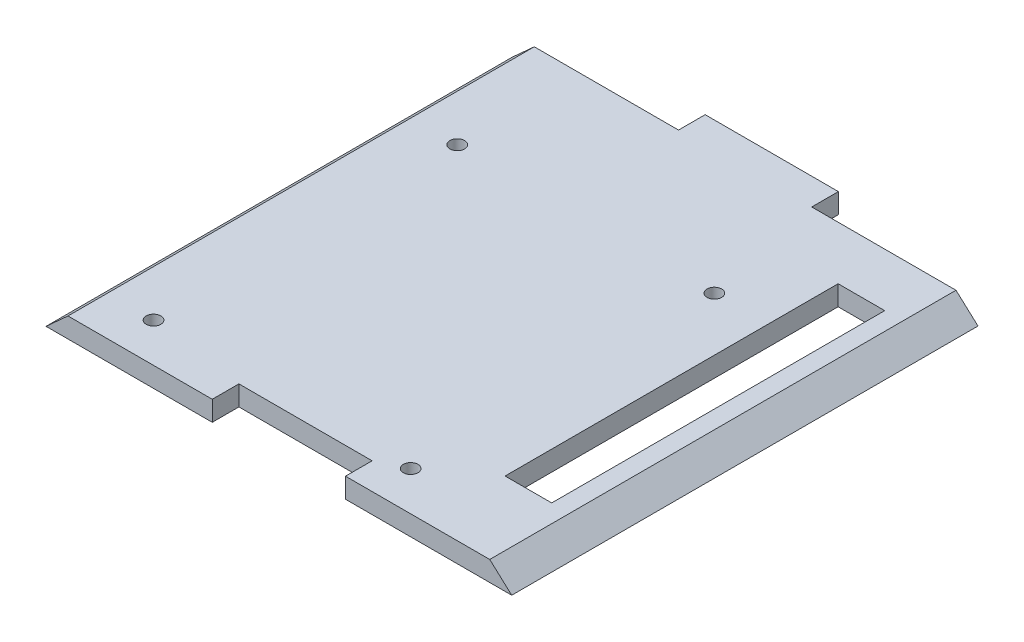
ISO-10303-21;
HEADER;
FILE_DESCRIPTION(('STEP AP214'),'2;1');
FILE_NAME('part.step','',(''),(''),'','','');
FILE_SCHEMA(('AUTOMOTIVE_DESIGN { 1 0 10303 214 1 1 1 1 }'));
ENDSEC;
DATA;
#1=APPLICATION_CONTEXT('core data for automotive mechanical design processes');
#2=APPLICATION_PROTOCOL_DEFINITION('international standard','automotive_design',2000,#1);
#3=PRODUCT_CONTEXT('',#1,'mechanical');
#4=PRODUCT('Part','Part','',(#3));
#5=PRODUCT_RELATED_PRODUCT_CATEGORY('part','',(#4));
#6=PRODUCT_DEFINITION_FORMATION('','',#4);
#7=PRODUCT_DEFINITION_CONTEXT('part definition',#1,'design');
#8=PRODUCT_DEFINITION('design','',#6,#7);
#9=PRODUCT_DEFINITION_SHAPE('','',#8);
#10=(LENGTH_UNIT() NAMED_UNIT(*) SI_UNIT(.MILLI.,.METRE.));
#11=(NAMED_UNIT(*) PLANE_ANGLE_UNIT() SI_UNIT($,.RADIAN.));
#12=(NAMED_UNIT(*) SI_UNIT($,.STERADIAN.) SOLID_ANGLE_UNIT());
#13=UNCERTAINTY_MEASURE_WITH_UNIT(LENGTH_MEASURE(1.E-05),#10,'distance_accuracy_value','');
#14=(GEOMETRIC_REPRESENTATION_CONTEXT(3) GLOBAL_UNCERTAINTY_ASSIGNED_CONTEXT((#13)) GLOBAL_UNIT_ASSIGNED_CONTEXT((#10,
#11,#12)) REPRESENTATION_CONTEXT('',''));
#15=CARTESIAN_POINT('',(0.,0.,0.));
#16=DIRECTION('',(0.,0.,1.));
#17=DIRECTION('',(1.,0.,0.));
#18=AXIS2_PLACEMENT_3D('',#15,#16,#17);
#19=CARTESIAN_POINT('',(0.,0.,0.));
#20=DIRECTION('',(0.,0.,1.));
#21=DIRECTION('',(1.,0.,0.));
#22=AXIS2_PLACEMENT_3D('',#19,#20,#21);
#23=PLANE('',#22);
#24=DIRECTION('',(-1.,0.,0.));
#25=VECTOR('',#24,1.);
#26=CARTESIAN_POINT('',(-40.2038837694651,5.93778829627168,0.));
#27=LINE('',#26,#25);
#28=CARTESIAN_POINT('',(-12.7,5.93778829627168,0.));
#29=VERTEX_POINT('',#28);
#30=CARTESIAN_POINT('',(-40.2038837694651,5.93778829627168,0.));
#31=VERTEX_POINT('',#30);
#32=EDGE_CURVE('E283',#29,#31,#27,.T.);
#33=ORIENTED_EDGE('',*,*,#32,.F.);
#34=DIRECTION('',(0.,-1.,0.));
#35=VECTOR('',#34,1.);
#36=CARTESIAN_POINT('',(-12.7,5.93778829627168,0.));
#37=LINE('',#36,#35);
#38=CARTESIAN_POINT('',(-12.7,2.12778829627168,0.));
#39=VERTEX_POINT('',#38);
#40=EDGE_CURVE('E205',#29,#39,#37,.T.);
#41=ORIENTED_EDGE('',*,*,#40,.T.);
#42=DIRECTION('',(1.,0.,0.));
#43=VECTOR('',#42,1.);
#44=CARTESIAN_POINT('',(-44.39904297354,2.12778829627168,0.));
#45=LINE('',#44,#43);
#46=CARTESIAN_POINT('',(-44.39904297354,2.12778829627168,0.));
#47=VERTEX_POINT('',#46);
#48=EDGE_CURVE('E278',#47,#39,#45,.T.);
#49=ORIENTED_EDGE('',*,*,#48,.F.);
#50=DIRECTION('',(-0.740272077106257,-0.672307408747507,0.));
#51=VECTOR('',#50,1.);
#52=CARTESIAN_POINT('',(-40.2038837694651,5.93778829627168,0.));
#53=LINE('',#52,#51);
#54=EDGE_CURVE('E257',#31,#47,#53,.T.);
#55=ORIENTED_EDGE('',*,*,#54,.F.);
#56=EDGE_LOOP('',(#33,#41,#49,#55));
#57=FACE_BOUND('',#56,.T.);
#58=ADVANCED_FACE('F34',(#57),#23,.F.);
#59=CARTESIAN_POINT('',(0.,0.,88.9));
#60=DIRECTION('',(0.,0.,1.));
#61=DIRECTION('',(1.,0.,0.));
#62=AXIS2_PLACEMENT_3D('',#59,#60,#61);
#63=PLANE('',#62);
#64=DIRECTION('',(0.,-1.,0.));
#65=VECTOR('',#64,1.);
#66=CARTESIAN_POINT('',(-12.7,5.93778829627168,88.9));
#67=LINE('',#66,#65);
#68=CARTESIAN_POINT('',(-12.7,5.93778829627168,88.9));
#69=VERTEX_POINT('',#68);
#70=CARTESIAN_POINT('',(-12.7,2.12778829627168,88.9));
#71=VERTEX_POINT('',#70);
#72=EDGE_CURVE('E227',#69,#71,#67,.T.);
#73=ORIENTED_EDGE('',*,*,#72,.F.);
#74=DIRECTION('',(-1.,0.,0.));
#75=VECTOR('',#74,1.);
#76=CARTESIAN_POINT('',(-40.2038837694651,5.93778829627168,88.9));
#77=LINE('',#76,#75);
#78=CARTESIAN_POINT('',(-40.2038837694651,5.93778829627168,88.9));
#79=VERTEX_POINT('',#78);
#80=EDGE_CURVE('E270',#69,#79,#77,.T.);
#81=ORIENTED_EDGE('',*,*,#80,.T.);
#82=DIRECTION('',(-0.740272077106257,-0.672307408747507,0.));
#83=VECTOR('',#82,1.);
#84=CARTESIAN_POINT('',(-40.2038837694651,5.93778829627168,88.9));
#85=LINE('',#84,#83);
#86=CARTESIAN_POINT('',(-44.39904297354,2.12778829627168,88.9));
#87=VERTEX_POINT('',#86);
#88=EDGE_CURVE('E260',#79,#87,#85,.T.);
#89=ORIENTED_EDGE('',*,*,#88,.T.);
#90=DIRECTION('',(1.,0.,0.));
#91=VECTOR('',#90,1.);
#92=CARTESIAN_POINT('',(-44.39904297354,2.12778829627168,88.9));
#93=LINE('',#92,#91);
#94=EDGE_CURVE('E265',#87,#71,#93,.T.);
#95=ORIENTED_EDGE('',*,*,#94,.T.);
#96=EDGE_LOOP('',(#73,#81,#89,#95));
#97=FACE_BOUND('',#96,.T.);
#98=ADVANCED_FACE('F330',(#97),#63,.T.);
#99=CARTESIAN_POINT('',(-40.2038837694651,5.93778829627168,88.9));
#100=DIRECTION('',(0.672307408747508,-0.740272077106257,0.));
#101=DIRECTION('',(0.740272077106257,0.672307408747508,0.));
#102=AXIS2_PLACEMENT_3D('',#99,#100,#101);
#103=PLANE('',#102);
#104=ORIENTED_EDGE('',*,*,#54,.T.);
#105=DIRECTION('',(0.,0.,-1.));
#106=VECTOR('',#105,1.);
#107=CARTESIAN_POINT('',(-44.39904297354,2.12778829627168,88.9));
#108=LINE('',#107,#106);
#109=EDGE_CURVE('E11',#87,#47,#108,.T.);
#110=ORIENTED_EDGE('',*,*,#109,.F.);
#111=ORIENTED_EDGE('',*,*,#88,.F.);
#112=DIRECTION('',(0.,0.,-1.));
#113=VECTOR('',#112,1.);
#114=CARTESIAN_POINT('',(-40.2038837694651,5.93778829627168,88.9));
#115=LINE('',#114,#113);
#116=EDGE_CURVE('E274',#79,#31,#115,.T.);
#117=ORIENTED_EDGE('',*,*,#116,.T.);
#118=EDGE_LOOP('',(#104,#110,#111,#117));
#119=FACE_BOUND('',#118,.T.);
#120=ADVANCED_FACE('F36',(#119),#103,.F.);
#121=CARTESIAN_POINT('',(-44.39904297354,2.12778829627168,88.9));
#122=DIRECTION('',(0.,1.,0.));
#123=DIRECTION('',(0.,0.,1.));
#124=AXIS2_PLACEMENT_3D('',#121,#122,#123);
#125=PLANE('',#124);
#126=DIRECTION('',(1.,0.,0.));
#127=VECTOR('',#126,1.);
#128=CARTESIAN_POINT('',(27.88904297354,2.12778829627168,10.16));
#129=LINE('',#128,#127);
#130=CARTESIAN_POINT('',(27.88904297354,2.12778829627168,10.16));
#131=VERTEX_POINT('',#130);
#132=CARTESIAN_POINT('',(36.77904297354,2.12778829627168,10.16));
#133=VERTEX_POINT('',#132);
#134=EDGE_CURVE('E174',#131,#133,#129,.T.);
#135=ORIENTED_EDGE('',*,*,#134,.F.);
#136=DIRECTION('',(0.,0.,-1.));
#137=VECTOR('',#136,1.);
#138=CARTESIAN_POINT('',(27.88904297354,2.12778829627168,73.66));
#139=LINE('',#138,#137);
#140=CARTESIAN_POINT('',(27.88904297354,2.12778829627168,73.66));
#141=VERTEX_POINT('',#140);
#142=EDGE_CURVE('E49',#141,#131,#139,.T.);
#143=ORIENTED_EDGE('',*,*,#142,.F.);
#144=DIRECTION('',(-1.,0.,0.));
#145=VECTOR('',#144,1.);
#146=CARTESIAN_POINT('',(27.88904297354,2.12778829627168,73.66));
#147=LINE('',#146,#145);
#148=CARTESIAN_POINT('',(36.77904297354,2.12778829627168,73.66));
#149=VERTEX_POINT('',#148);
#150=EDGE_CURVE('E165',#149,#141,#147,.T.);
#151=ORIENTED_EDGE('',*,*,#150,.F.);
#152=DIRECTION('',(0.,0.,1.));
#153=VECTOR('',#152,1.);
#154=CARTESIAN_POINT('',(36.77904297354,2.12778829627168,73.66));
#155=LINE('',#154,#153);
#156=EDGE_CURVE('E168',#133,#149,#155,.T.);
#157=ORIENTED_EDGE('',*,*,#156,.F.);
#158=EDGE_LOOP('',(#135,#143,#151,#157));
#159=FACE_BOUND('',#158,.T.);
#160=ORIENTED_EDGE('',*,*,#48,.T.);
#161=DIRECTION('',(0.,0.,-1.));
#162=VECTOR('',#161,1.);
#163=CARTESIAN_POINT('',(-12.7,2.12778829627168,5.08));
#164=LINE('',#163,#162);
#165=CARTESIAN_POINT('',(-12.7,2.12778829627168,-5.08));
#166=VERTEX_POINT('',#165);
#167=EDGE_CURVE('E196',#39,#166,#164,.T.);
#168=ORIENTED_EDGE('',*,*,#167,.T.);
#169=DIRECTION('',(1.,0.,0.));
#170=VECTOR('',#169,1.);
#171=CARTESIAN_POINT('',(12.7,2.12778829627168,-5.08));
#172=LINE('',#171,#170);
#173=CARTESIAN_POINT('',(12.7,2.12778829627168,-5.08));
#174=VERTEX_POINT('',#173);
#175=EDGE_CURVE('E188',#166,#174,#172,.T.);
#176=ORIENTED_EDGE('',*,*,#175,.T.);
#177=DIRECTION('',(0.,0.,1.));
#178=VECTOR('',#177,1.);
#179=CARTESIAN_POINT('',(12.7,2.12778829627168,5.08));
#180=LINE('',#179,#178);
#181=CARTESIAN_POINT('',(12.7,2.12778829627168,0.));
#182=VERTEX_POINT('',#181);
#183=EDGE_CURVE('E180',#174,#182,#180,.T.);
#184=ORIENTED_EDGE('',*,*,#183,.T.);
#185=CARTESIAN_POINT('',(44.39904297354,2.12778829627168,0.));
#186=VERTEX_POINT('',#185);
#187=EDGE_CURVE('E277',#182,#186,#45,.T.);
#188=ORIENTED_EDGE('',*,*,#187,.T.);
#189=DIRECTION('',(0.,0.,-1.));
#190=VECTOR('',#189,1.);
#191=CARTESIAN_POINT('',(44.39904297354,2.12778829627168,88.9));
#192=LINE('',#191,#190);
#193=CARTESIAN_POINT('',(44.39904297354,2.12778829627168,88.9));
#194=VERTEX_POINT('',#193);
#195=EDGE_CURVE('E42',#194,#186,#192,.T.);
#196=ORIENTED_EDGE('',*,*,#195,.F.);
#197=CARTESIAN_POINT('',(12.7,2.12778829627168,88.9));
#198=VERTEX_POINT('',#197);
#199=EDGE_CURVE('E263',#198,#194,#93,.T.);
#200=ORIENTED_EDGE('',*,*,#199,.F.);
#201=DIRECTION('',(0.,0.,1.));
#202=VECTOR('',#201,1.);
#203=CARTESIAN_POINT('',(12.7,2.12778829627168,88.9));
#204=LINE('',#203,#202);
#205=CARTESIAN_POINT('',(12.7,2.12778829627168,83.82));
#206=VERTEX_POINT('',#205);
#207=EDGE_CURVE('E214',#206,#198,#204,.T.);
#208=ORIENTED_EDGE('',*,*,#207,.F.);
#209=DIRECTION('',(1.,0.,0.));
#210=VECTOR('',#209,1.);
#211=CARTESIAN_POINT('',(-12.7,2.12778829627168,83.82));
#212=LINE('',#211,#210);
#213=CARTESIAN_POINT('',(-12.7,2.12778829627168,83.82));
#214=VERTEX_POINT('',#213);
#215=EDGE_CURVE('E223',#214,#206,#212,.T.);
#216=ORIENTED_EDGE('',*,*,#215,.F.);
#217=DIRECTION('',(0.,0.,-1.));
#218=VECTOR('',#217,1.);
#219=CARTESIAN_POINT('',(-12.7,2.12778829627168,88.9));
#220=LINE('',#219,#218);
#221=EDGE_CURVE('E207',#71,#214,#220,.T.);
#222=ORIENTED_EDGE('',*,*,#221,.F.);
#223=ORIENTED_EDGE('',*,*,#94,.F.);
#224=ORIENTED_EDGE('',*,*,#109,.T.);
#225=EDGE_LOOP('',(#160,#168,#176,#184,#188,#196,#200,#208,#216,#222,#223,#224));
#226=FACE_BOUND('',#225,.T.);
#227=CARTESIAN_POINT('',(17.653,2.12778829627168,81.4299956494438));
#228=DIRECTION('',(0.,-1.,0.));
#229=DIRECTION('',(0.,0.,1.));
#230=AXIS2_PLACEMENT_3D('',#227,#228,#229);
#231=CIRCLE('',#230,1.39700000000001);
#232=CARTESIAN_POINT('',(17.653,2.12778829627168,80.0329956494437));
#233=VERTEX_POINT('',#232);
#234=EDGE_CURVE('E229',#233,#233,#231,.T.);
#235=ORIENTED_EDGE('',*,*,#234,.F.);
#236=EDGE_LOOP('',(#235));
#237=FACE_BOUND('',#236,.T.);
#238=CARTESIAN_POINT('',(-31.369,2.12778829627168,23.5179956494438));
#239=DIRECTION('',(0.,-1.,0.));
#240=DIRECTION('',(0.,0.,-1.));
#241=AXIS2_PLACEMENT_3D('',#238,#239,#240);
#242=CIRCLE('',#241,1.397);
#243=CARTESIAN_POINT('',(-31.369,2.12778829627168,22.1209956494438));
#244=VERTEX_POINT('',#243);
#245=EDGE_CURVE('E240',#244,#244,#242,.T.);
#246=ORIENTED_EDGE('',*,*,#245,.F.);
#247=EDGE_LOOP('',(#246));
#248=FACE_BOUND('',#247,.T.);
#249=CARTESIAN_POINT('',(17.653,2.12778829627168,23.5179956494438));
#250=DIRECTION('',(0.,-1.,0.));
#251=DIRECTION('',(0.,0.,1.));
#252=AXIS2_PLACEMENT_3D('',#249,#250,#251);
#253=CIRCLE('',#252,1.397);
#254=CARTESIAN_POINT('',(17.653,2.12778829627168,22.1209956494438));
#255=VERTEX_POINT('',#254);
#256=EDGE_CURVE('E239',#255,#255,#253,.T.);
#257=ORIENTED_EDGE('',*,*,#256,.F.);
#258=EDGE_LOOP('',(#257));
#259=FACE_BOUND('',#258,.T.);
#260=CARTESIAN_POINT('',(-31.369,2.12778829627168,81.4299956494438));
#261=DIRECTION('',(0.,-1.,0.));
#262=DIRECTION('',(0.,0.,-1.));
#263=AXIS2_PLACEMENT_3D('',#260,#261,#262);
#264=CIRCLE('',#263,1.39700000000001);
#265=CARTESIAN_POINT('',(-31.369,2.12778829627168,80.0329956494437));
#266=VERTEX_POINT('',#265);
#267=EDGE_CURVE('E251',#266,#266,#264,.T.);
#268=ORIENTED_EDGE('',*,*,#267,.F.);
#269=EDGE_LOOP('',(#268));
#270=FACE_BOUND('',#269,.T.);
#271=ADVANCED_FACE('F321',(#159,#226,#237,#248,#259,#270),#125,.F.);
#272=CARTESIAN_POINT('',(40.2038837694651,5.93778829627168,88.9));
#273=DIRECTION('',(-0.672307408747508,-0.740272077106257,0.));
#274=DIRECTION('',(0.740272077106257,-0.672307408747508,0.));
#275=AXIS2_PLACEMENT_3D('',#272,#273,#274);
#276=PLANE('',#275);
#277=DIRECTION('',(-0.740272077106257,0.672307408747507,0.));
#278=VECTOR('',#277,1.);
#279=CARTESIAN_POINT('',(40.2038837694651,5.93778829627168,0.));
#280=LINE('',#279,#278);
#281=CARTESIAN_POINT('',(40.2038837694651,5.93778829627168,0.));
#282=VERTEX_POINT('',#281);
#283=EDGE_CURVE('E281',#186,#282,#280,.T.);
#284=ORIENTED_EDGE('',*,*,#283,.T.);
#285=DIRECTION('',(0.,0.,-1.));
#286=VECTOR('',#285,1.);
#287=CARTESIAN_POINT('',(40.2038837694651,5.93778829627168,88.9));
#288=LINE('',#287,#286);
#289=CARTESIAN_POINT('',(40.2038837694651,5.93778829627168,88.9));
#290=VERTEX_POINT('',#289);
#291=EDGE_CURVE('E288',#290,#282,#288,.T.);
#292=ORIENTED_EDGE('',*,*,#291,.F.);
#293=DIRECTION('',(-0.740272077106257,0.672307408747507,0.));
#294=VECTOR('',#293,1.);
#295=CARTESIAN_POINT('',(40.2038837694651,5.93778829627168,88.9));
#296=LINE('',#295,#294);
#297=EDGE_CURVE('E268',#194,#290,#296,.T.);
#298=ORIENTED_EDGE('',*,*,#297,.F.);
#299=ORIENTED_EDGE('',*,*,#195,.T.);
#300=EDGE_LOOP('',(#284,#292,#298,#299));
#301=FACE_BOUND('',#300,.T.);
#302=ADVANCED_FACE('F295',(#301),#276,.F.);
#303=CARTESIAN_POINT('',(-40.2038837694651,5.93778829627168,88.9));
#304=DIRECTION('',(0.,-1.,0.));
#305=DIRECTION('',(0.,0.,-1.));
#306=AXIS2_PLACEMENT_3D('',#303,#304,#305);
#307=PLANE('',#306);
#308=DIRECTION('',(-1.,0.,0.));
#309=VECTOR('',#308,1.);
#310=CARTESIAN_POINT('',(27.88904297354,5.93778829627168,73.66));
#311=LINE('',#310,#309);
#312=CARTESIAN_POINT('',(36.77904297354,5.93778829627168,73.66));
#313=VERTEX_POINT('',#312);
#314=CARTESIAN_POINT('',(27.88904297354,5.93778829627168,73.66));
#315=VERTEX_POINT('',#314);
#316=EDGE_CURVE('E155',#313,#315,#311,.T.);
#317=ORIENTED_EDGE('',*,*,#316,.T.);
#318=DIRECTION('',(0.,0.,-1.));
#319=VECTOR('',#318,1.);
#320=CARTESIAN_POINT('',(27.88904297354,5.93778829627168,73.66));
#321=LINE('',#320,#319);
#322=CARTESIAN_POINT('',(27.88904297354,5.93778829627168,10.16));
#323=VERTEX_POINT('',#322);
#324=EDGE_CURVE('E149',#315,#323,#321,.T.);
#325=ORIENTED_EDGE('',*,*,#324,.T.);
#326=DIRECTION('',(1.,0.,0.));
#327=VECTOR('',#326,1.);
#328=CARTESIAN_POINT('',(27.88904297354,5.93778829627168,10.16));
#329=LINE('',#328,#327);
#330=CARTESIAN_POINT('',(36.77904297354,5.93778829627168,10.16));
#331=VERTEX_POINT('',#330);
#332=EDGE_CURVE('E158',#323,#331,#329,.T.);
#333=ORIENTED_EDGE('',*,*,#332,.T.);
#334=DIRECTION('',(0.,0.,1.));
#335=VECTOR('',#334,1.);
#336=CARTESIAN_POINT('',(36.77904297354,5.93778829627168,73.66));
#337=LINE('',#336,#335);
#338=EDGE_CURVE('E57',#331,#313,#337,.T.);
#339=ORIENTED_EDGE('',*,*,#338,.T.);
#340=EDGE_LOOP('',(#317,#325,#333,#339));
#341=FACE_BOUND('',#340,.T.);
#342=DIRECTION('',(0.,0.,-1.));
#343=VECTOR('',#342,1.);
#344=CARTESIAN_POINT('',(-12.7,5.93778829627168,5.08));
#345=LINE('',#344,#343);
#346=CARTESIAN_POINT('',(-12.7,5.93778829627168,-5.08));
#347=VERTEX_POINT('',#346);
#348=EDGE_CURVE('E187',#29,#347,#345,.T.);
#349=ORIENTED_EDGE('',*,*,#348,.F.);
#350=ORIENTED_EDGE('',*,*,#32,.T.);
#351=ORIENTED_EDGE('',*,*,#116,.F.);
#352=ORIENTED_EDGE('',*,*,#80,.F.);
#353=DIRECTION('',(0.,0.,-1.));
#354=VECTOR('',#353,1.);
#355=CARTESIAN_POINT('',(-12.7,5.93778829627168,88.9));
#356=LINE('',#355,#354);
#357=CARTESIAN_POINT('',(-12.7,5.93778829627168,83.82));
#358=VERTEX_POINT('',#357);
#359=EDGE_CURVE('E210',#69,#358,#356,.T.);
#360=ORIENTED_EDGE('',*,*,#359,.T.);
#361=DIRECTION('',(1.,0.,0.));
#362=VECTOR('',#361,1.);
#363=CARTESIAN_POINT('',(-12.7,5.93778829627168,83.82));
#364=LINE('',#363,#362);
#365=CARTESIAN_POINT('',(12.7,5.93778829627168,83.82));
#366=VERTEX_POINT('',#365);
#367=EDGE_CURVE('E213',#358,#366,#364,.T.);
#368=ORIENTED_EDGE('',*,*,#367,.T.);
#369=DIRECTION('',(0.,0.,1.));
#370=VECTOR('',#369,1.);
#371=CARTESIAN_POINT('',(12.7,5.93778829627168,88.9));
#372=LINE('',#371,#370);
#373=CARTESIAN_POINT('',(12.7,5.93778829627168,88.9));
#374=VERTEX_POINT('',#373);
#375=EDGE_CURVE('E217',#366,#374,#372,.T.);
#376=ORIENTED_EDGE('',*,*,#375,.T.);
#377=EDGE_CURVE('E271',#290,#374,#77,.T.);
#378=ORIENTED_EDGE('',*,*,#377,.F.);
#379=ORIENTED_EDGE('',*,*,#291,.T.);
#380=CARTESIAN_POINT('',(12.7,5.93778829627168,0.));
#381=VERTEX_POINT('',#380);
#382=EDGE_CURVE('E264',#282,#381,#27,.T.);
#383=ORIENTED_EDGE('',*,*,#382,.T.);
#384=DIRECTION('',(0.,0.,1.));
#385=VECTOR('',#384,1.);
#386=CARTESIAN_POINT('',(12.7,5.93778829627168,5.08));
#387=LINE('',#386,#385);
#388=CARTESIAN_POINT('',(12.7,5.93778829627168,-5.08));
#389=VERTEX_POINT('',#388);
#390=EDGE_CURVE('E184',#389,#381,#387,.T.);
#391=ORIENTED_EDGE('',*,*,#390,.F.);
#392=DIRECTION('',(1.,0.,0.));
#393=VECTOR('',#392,1.);
#394=CARTESIAN_POINT('',(12.7,5.93778829627168,-5.08));
#395=LINE('',#394,#393);
#396=EDGE_CURVE('E190',#347,#389,#395,.T.);
#397=ORIENTED_EDGE('',*,*,#396,.F.);
#398=EDGE_LOOP('',(#349,#350,#351,#352,#360,#368,#376,#378,#379,#383,#391,#397));
#399=FACE_BOUND('',#398,.T.);
#400=CARTESIAN_POINT('',(17.653,5.93778829627168,81.4299956494438));
#401=DIRECTION('',(0.,-1.,0.));
#402=DIRECTION('',(0.,0.,1.));
#403=AXIS2_PLACEMENT_3D('',#400,#401,#402);
#404=CIRCLE('',#403,1.39700000000001);
#405=CARTESIAN_POINT('',(17.653,5.93778829627168,80.0329956494437));
#406=VERTEX_POINT('',#405);
#407=EDGE_CURVE('E243',#406,#406,#404,.T.);
#408=ORIENTED_EDGE('',*,*,#407,.T.);
#409=EDGE_LOOP('',(#408));
#410=FACE_BOUND('',#409,.T.);
#411=CARTESIAN_POINT('',(-31.369,5.93778829627168,23.5179956494438));
#412=DIRECTION('',(0.,-1.,0.));
#413=DIRECTION('',(0.,0.,-1.));
#414=AXIS2_PLACEMENT_3D('',#411,#412,#413);
#415=CIRCLE('',#414,1.397);
#416=CARTESIAN_POINT('',(-31.369,5.93778829627168,22.1209956494438));
#417=VERTEX_POINT('',#416);
#418=EDGE_CURVE('E236',#417,#417,#415,.T.);
#419=ORIENTED_EDGE('',*,*,#418,.T.);
#420=EDGE_LOOP('',(#419));
#421=FACE_BOUND('',#420,.T.);
#422=CARTESIAN_POINT('',(17.653,5.93778829627168,23.5179956494438));
#423=DIRECTION('',(0.,-1.,0.));
#424=DIRECTION('',(0.,0.,1.));
#425=AXIS2_PLACEMENT_3D('',#422,#423,#424);
#426=CIRCLE('',#425,1.397);
#427=CARTESIAN_POINT('',(17.653,5.93778829627168,22.1209956494438));
#428=VERTEX_POINT('',#427);
#429=EDGE_CURVE('E248',#428,#428,#426,.T.);
#430=ORIENTED_EDGE('',*,*,#429,.T.);
#431=EDGE_LOOP('',(#430));
#432=FACE_BOUND('',#431,.T.);
#433=CARTESIAN_POINT('',(-31.369,5.93778829627168,81.4299956494438));
#434=DIRECTION('',(0.,-1.,0.));
#435=DIRECTION('',(0.,0.,-1.));
#436=AXIS2_PLACEMENT_3D('',#433,#434,#435);
#437=CIRCLE('',#436,1.39700000000001);
#438=CARTESIAN_POINT('',(-31.369,5.93778829627168,80.0329956494437));
#439=VERTEX_POINT('',#438);
#440=EDGE_CURVE('E254',#439,#439,#437,.T.);
#441=ORIENTED_EDGE('',*,*,#440,.T.);
#442=EDGE_LOOP('',(#441));
#443=FACE_BOUND('',#442,.T.);
#444=ADVANCED_FACE('F162',(#341,#399,#410,#421,#432,#443),#307,.F.);
#445=DIRECTION('',(0.,-1.,0.));
#446=VECTOR('',#445,1.);
#447=CARTESIAN_POINT('',(12.7,5.93778829627168,88.9));
#448=LINE('',#447,#446);
#449=EDGE_CURVE('E230',#374,#198,#448,.T.);
#450=ORIENTED_EDGE('',*,*,#449,.T.);
#451=ORIENTED_EDGE('',*,*,#199,.T.);
#452=ORIENTED_EDGE('',*,*,#297,.T.);
#453=ORIENTED_EDGE('',*,*,#377,.T.);
#454=EDGE_LOOP('',(#450,#451,#452,#453));
#455=FACE_BOUND('',#454,.T.);
#456=ADVANCED_FACE('F341',(#455),#63,.T.);
#457=ORIENTED_EDGE('',*,*,#187,.F.);
#458=DIRECTION('',(0.,-1.,0.));
#459=VECTOR('',#458,1.);
#460=CARTESIAN_POINT('',(12.7,5.93778829627168,0.));
#461=LINE('',#460,#459);
#462=EDGE_CURVE('E202',#381,#182,#461,.T.);
#463=ORIENTED_EDGE('',*,*,#462,.F.);
#464=ORIENTED_EDGE('',*,*,#382,.F.);
#465=ORIENTED_EDGE('',*,*,#283,.F.);
#466=EDGE_LOOP('',(#457,#463,#464,#465));
#467=FACE_BOUND('',#466,.T.);
#468=ADVANCED_FACE('F301',(#467),#23,.F.);
#469=CARTESIAN_POINT('',(-31.369,5.93778829627168,81.4299956494438));
#470=DIRECTION('',(0.,-1.,0.));
#471=DIRECTION('',(0.,0.,-1.));
#472=AXIS2_PLACEMENT_3D('',#469,#470,#471);
#473=CYLINDRICAL_SURFACE('',#472,1.39700000000001);
#474=CARTESIAN_POINT('',(-31.369,5.93778829627168,80.0329956494437));
#475=CARTESIAN_POINT('',(-31.369,5.89810079627168,80.0329956494437));
#476=CARTESIAN_POINT('',(-31.369,5.85841329627168,80.0329956494437));
#477=CARTESIAN_POINT('',(-31.369,5.77903829627168,80.0329956494437));
#478=CARTESIAN_POINT('',(-31.369,5.73935079627168,80.0329956494437));
#479=CARTESIAN_POINT('',(-31.369,5.65997579627168,80.0329956494437));
#480=CARTESIAN_POINT('',(-31.369,5.62028829627168,80.0329956494437));
#481=CARTESIAN_POINT('',(-31.369,5.54091329627168,80.0329956494437));
#482=CARTESIAN_POINT('',(-31.369,5.50122579627168,80.0329956494437));
#483=CARTESIAN_POINT('',(-31.369,5.42185079627168,80.0329956494437));
#484=CARTESIAN_POINT('',(-31.369,5.38216329627168,80.0329956494437));
#485=CARTESIAN_POINT('',(-31.369,5.30278829627168,80.0329956494437));
#486=CARTESIAN_POINT('',(-31.369,5.26310079627168,80.0329956494437));
#487=CARTESIAN_POINT('',(-31.369,5.18372579627168,80.0329956494437));
#488=CARTESIAN_POINT('',(-31.369,5.14403829627168,80.0329956494437));
#489=CARTESIAN_POINT('',(-31.369,5.06466329627168,80.0329956494437));
#490=CARTESIAN_POINT('',(-31.369,5.02497579627168,80.0329956494437));
#491=CARTESIAN_POINT('',(-31.369,4.94560079627168,80.0329956494437));
#492=CARTESIAN_POINT('',(-31.369,4.90591329627168,80.0329956494437));
#493=CARTESIAN_POINT('',(-31.369,4.82653829627168,80.0329956494437));
#494=CARTESIAN_POINT('',(-31.369,4.78685079627168,80.0329956494437));
#495=CARTESIAN_POINT('',(-31.369,4.70747579627168,80.0329956494437));
#496=CARTESIAN_POINT('',(-31.369,4.66778829627168,80.0329956494437));
#497=CARTESIAN_POINT('',(-31.369,4.58841329627168,80.0329956494437));
#498=CARTESIAN_POINT('',(-31.369,4.54872579627168,80.0329956494437));
#499=CARTESIAN_POINT('',(-31.369,4.46935079627168,80.0329956494437));
#500=CARTESIAN_POINT('',(-31.369,4.42966329627168,80.0329956494437));
#501=CARTESIAN_POINT('',(-31.369,4.35028829627168,80.0329956494437));
#502=CARTESIAN_POINT('',(-31.369,4.31060079627168,80.0329956494437));
#503=CARTESIAN_POINT('',(-31.369,4.23122579627168,80.0329956494437));
#504=CARTESIAN_POINT('',(-31.369,4.19153829627168,80.0329956494437));
#505=CARTESIAN_POINT('',(-31.369,4.11216329627168,80.0329956494437));
#506=CARTESIAN_POINT('',(-31.369,4.07247579627168,80.0329956494437));
#507=CARTESIAN_POINT('',(-31.369,3.99310079627168,80.0329956494437));
#508=CARTESIAN_POINT('',(-31.369,3.95341329627168,80.0329956494437));
#509=CARTESIAN_POINT('',(-31.369,3.87403829627168,80.0329956494437));
#510=CARTESIAN_POINT('',(-31.369,3.83435079627168,80.0329956494437));
#511=CARTESIAN_POINT('',(-31.369,3.75497579627168,80.0329956494437));
#512=CARTESIAN_POINT('',(-31.369,3.71528829627168,80.0329956494437));
#513=CARTESIAN_POINT('',(-31.369,3.63591329627168,80.0329956494437));
#514=CARTESIAN_POINT('',(-31.369,3.59622579627168,80.0329956494437));
#515=CARTESIAN_POINT('',(-31.369,3.51685079627168,80.0329956494437));
#516=CARTESIAN_POINT('',(-31.369,3.47716329627168,80.0329956494437));
#517=CARTESIAN_POINT('',(-31.369,3.39778829627168,80.0329956494437));
#518=CARTESIAN_POINT('',(-31.369,3.35810079627168,80.0329956494437));
#519=CARTESIAN_POINT('',(-31.369,3.27872579627168,80.0329956494437));
#520=CARTESIAN_POINT('',(-31.369,3.23903829627168,80.0329956494437));
#521=CARTESIAN_POINT('',(-31.369,3.15966329627168,80.0329956494437));
#522=CARTESIAN_POINT('',(-31.369,3.11997579627168,80.0329956494437));
#523=CARTESIAN_POINT('',(-31.369,3.04060079627168,80.0329956494437));
#524=CARTESIAN_POINT('',(-31.369,3.00091329627168,80.0329956494437));
#525=CARTESIAN_POINT('',(-31.369,2.92153829627168,80.0329956494437));
#526=CARTESIAN_POINT('',(-31.369,2.88185079627168,80.0329956494437));
#527=CARTESIAN_POINT('',(-31.369,2.80247579627168,80.0329956494437));
#528=CARTESIAN_POINT('',(-31.369,2.76278829627168,80.0329956494437));
#529=CARTESIAN_POINT('',(-31.369,2.68341329627168,80.0329956494437));
#530=CARTESIAN_POINT('',(-31.369,2.64372579627168,80.0329956494437));
#531=CARTESIAN_POINT('',(-31.369,2.56435079627168,80.0329956494437));
#532=CARTESIAN_POINT('',(-31.369,2.52466329627168,80.0329956494437));
#533=CARTESIAN_POINT('',(-31.369,2.44528829627168,80.0329956494437));
#534=CARTESIAN_POINT('',(-31.369,2.40560079627168,80.0329956494437));
#535=CARTESIAN_POINT('',(-31.369,2.32622579627168,80.0329956494437));
#536=CARTESIAN_POINT('',(-31.369,2.28653829627168,80.0329956494437));
#537=CARTESIAN_POINT('',(-31.369,2.20716329627168,80.0329956494437));
#538=CARTESIAN_POINT('',(-31.369,2.16747579627168,80.0329956494437));
#539=CARTESIAN_POINT('',(-31.369,2.12778829627168,80.0329956494437));
#540=B_SPLINE_CURVE_WITH_KNOTS('',3,(#474,#475,#476,#477,#478,#479,#480,#481,#482,#483,#484,
#485,#486,#487,#488,#489,#490,#491,#492,#493,#494,#495,#496,#497,#498,#499,#500,#501,#502,#503,
#504,#505,#506,#507,#508,#509,#510,#511,#512,#513,#514,#515,#516,#517,#518,#519,#520,#521,#522,
#523,#524,#525,#526,#527,#528,#529,#530,#531,#532,#533,#534,#535,#536,#537,#538,#539),
.UNSPECIFIED.,.F.,.F.,(4,2,2,2,2,2,2,2,2,2,2,2,2,2,2,2,2,2,2,2,2,2,2,2,2,2,2,2,2,2,2,2,4),(0.,
0.119062499999999,0.238125,0.3571875,0.476249999999999,0.595312499999999,0.714375,
0.833437499999999,0.952499999999999,1.0715625,1.190625,1.3096875,1.42875,1.5478125,1.666875,
1.7859375,1.905,2.0240625,2.143125,2.2621875,2.38125,2.5003125,2.619375,2.7384375,2.8575,
2.9765625,3.095625,3.2146875,3.33375,3.4528125,3.571875,3.6909375,3.81),.UNSPECIFIED.);
#541=EDGE_CURVE('BSEAM361',#439,#266,#540,.T.);
#542=ORIENTED_EDGE('',*,*,#440,.F.);
#543=ORIENTED_EDGE('',*,*,#267,.T.);
#544=ORIENTED_EDGE('',*,*,#541,.T.);
#545=ORIENTED_EDGE('',*,*,#541,.F.);
#546=EDGE_LOOP('',(#542,#544,#543,#545));
#547=FACE_BOUND('',#546,.T.);
#548=ADVANCED_FACE('F361',(#547),#473,.F.);
#549=CARTESIAN_POINT('',(17.653,5.93778829627168,23.5179956494438));
#550=DIRECTION('',(0.,-1.,0.));
#551=DIRECTION('',(0.,0.,-1.));
#552=AXIS2_PLACEMENT_3D('',#549,#550,#551);
#553=CYLINDRICAL_SURFACE('',#552,1.397);
#554=CARTESIAN_POINT('',(17.653,5.93778829627168,22.1209956494438));
#555=CARTESIAN_POINT('',(17.653,5.89810079627168,22.1209956494438));
#556=CARTESIAN_POINT('',(17.653,5.85841329627168,22.1209956494438));
#557=CARTESIAN_POINT('',(17.653,5.77903829627168,22.1209956494438));
#558=CARTESIAN_POINT('',(17.653,5.73935079627168,22.1209956494438));
#559=CARTESIAN_POINT('',(17.653,5.65997579627168,22.1209956494438));
#560=CARTESIAN_POINT('',(17.653,5.62028829627168,22.1209956494438));
#561=CARTESIAN_POINT('',(17.653,5.54091329627168,22.1209956494438));
#562=CARTESIAN_POINT('',(17.653,5.50122579627168,22.1209956494438));
#563=CARTESIAN_POINT('',(17.653,5.42185079627168,22.1209956494438));
#564=CARTESIAN_POINT('',(17.653,5.38216329627168,22.1209956494438));
#565=CARTESIAN_POINT('',(17.653,5.30278829627168,22.1209956494438));
#566=CARTESIAN_POINT('',(17.653,5.26310079627168,22.1209956494438));
#567=CARTESIAN_POINT('',(17.653,5.18372579627168,22.1209956494438));
#568=CARTESIAN_POINT('',(17.653,5.14403829627168,22.1209956494438));
#569=CARTESIAN_POINT('',(17.653,5.06466329627168,22.1209956494438));
#570=CARTESIAN_POINT('',(17.653,5.02497579627168,22.1209956494438));
#571=CARTESIAN_POINT('',(17.653,4.94560079627168,22.1209956494438));
#572=CARTESIAN_POINT('',(17.653,4.90591329627168,22.1209956494438));
#573=CARTESIAN_POINT('',(17.653,4.82653829627168,22.1209956494438));
#574=CARTESIAN_POINT('',(17.653,4.78685079627168,22.1209956494438));
#575=CARTESIAN_POINT('',(17.653,4.70747579627168,22.1209956494438));
#576=CARTESIAN_POINT('',(17.653,4.66778829627168,22.1209956494438));
#577=CARTESIAN_POINT('',(17.653,4.58841329627168,22.1209956494438));
#578=CARTESIAN_POINT('',(17.653,4.54872579627168,22.1209956494438));
#579=CARTESIAN_POINT('',(17.653,4.46935079627168,22.1209956494438));
#580=CARTESIAN_POINT('',(17.653,4.42966329627168,22.1209956494438));
#581=CARTESIAN_POINT('',(17.653,4.35028829627168,22.1209956494438));
#582=CARTESIAN_POINT('',(17.653,4.31060079627168,22.1209956494438));
#583=CARTESIAN_POINT('',(17.653,4.23122579627168,22.1209956494438));
#584=CARTESIAN_POINT('',(17.653,4.19153829627168,22.1209956494438));
#585=CARTESIAN_POINT('',(17.653,4.11216329627168,22.1209956494438));
#586=CARTESIAN_POINT('',(17.653,4.07247579627168,22.1209956494438));
#587=CARTESIAN_POINT('',(17.653,3.99310079627168,22.1209956494438));
#588=CARTESIAN_POINT('',(17.653,3.95341329627168,22.1209956494438));
#589=CARTESIAN_POINT('',(17.653,3.87403829627168,22.1209956494438));
#590=CARTESIAN_POINT('',(17.653,3.83435079627168,22.1209956494438));
#591=CARTESIAN_POINT('',(17.653,3.75497579627168,22.1209956494438));
#592=CARTESIAN_POINT('',(17.653,3.71528829627168,22.1209956494438));
#593=CARTESIAN_POINT('',(17.653,3.63591329627168,22.1209956494438));
#594=CARTESIAN_POINT('',(17.653,3.59622579627168,22.1209956494438));
#595=CARTESIAN_POINT('',(17.653,3.51685079627168,22.1209956494438));
#596=CARTESIAN_POINT('',(17.653,3.47716329627168,22.1209956494438));
#597=CARTESIAN_POINT('',(17.653,3.39778829627168,22.1209956494438));
#598=CARTESIAN_POINT('',(17.653,3.35810079627168,22.1209956494438));
#599=CARTESIAN_POINT('',(17.653,3.27872579627168,22.1209956494438));
#600=CARTESIAN_POINT('',(17.653,3.23903829627168,22.1209956494438));
#601=CARTESIAN_POINT('',(17.653,3.15966329627168,22.1209956494438));
#602=CARTESIAN_POINT('',(17.653,3.11997579627168,22.1209956494438));
#603=CARTESIAN_POINT('',(17.653,3.04060079627168,22.1209956494438));
#604=CARTESIAN_POINT('',(17.653,3.00091329627168,22.1209956494438));
#605=CARTESIAN_POINT('',(17.653,2.92153829627168,22.1209956494438));
#606=CARTESIAN_POINT('',(17.653,2.88185079627168,22.1209956494438));
#607=CARTESIAN_POINT('',(17.653,2.80247579627168,22.1209956494438));
#608=CARTESIAN_POINT('',(17.653,2.76278829627168,22.1209956494438));
#609=CARTESIAN_POINT('',(17.653,2.68341329627168,22.1209956494438));
#610=CARTESIAN_POINT('',(17.653,2.64372579627168,22.1209956494438));
#611=CARTESIAN_POINT('',(17.653,2.56435079627168,22.1209956494438));
#612=CARTESIAN_POINT('',(17.653,2.52466329627168,22.1209956494438));
#613=CARTESIAN_POINT('',(17.653,2.44528829627168,22.1209956494438));
#614=CARTESIAN_POINT('',(17.653,2.40560079627168,22.1209956494438));
#615=CARTESIAN_POINT('',(17.653,2.32622579627168,22.1209956494438));
#616=CARTESIAN_POINT('',(17.653,2.28653829627168,22.1209956494438));
#617=CARTESIAN_POINT('',(17.653,2.20716329627168,22.1209956494438));
#618=CARTESIAN_POINT('',(17.653,2.16747579627168,22.1209956494438));
#619=CARTESIAN_POINT('',(17.653,2.12778829627168,22.1209956494438));
#620=B_SPLINE_CURVE_WITH_KNOTS('',3,(#554,#555,#556,#557,#558,#559,#560,#561,#562,#563,#564,
#565,#566,#567,#568,#569,#570,#571,#572,#573,#574,#575,#576,#577,#578,#579,#580,#581,#582,#583,
#584,#585,#586,#587,#588,#589,#590,#591,#592,#593,#594,#595,#596,#597,#598,#599,#600,#601,#602,
#603,#604,#605,#606,#607,#608,#609,#610,#611,#612,#613,#614,#615,#616,#617,#618,#619),
.UNSPECIFIED.,.F.,.F.,(4,2,2,2,2,2,2,2,2,2,2,2,2,2,2,2,2,2,2,2,2,2,2,2,2,2,2,2,2,2,2,2,4),(0.,
0.119062499999999,0.238125,0.3571875,0.476249999999999,0.595312499999999,0.714375,
0.833437499999999,0.952499999999999,1.0715625,1.190625,1.3096875,1.42875,1.5478125,1.666875,
1.7859375,1.905,2.0240625,2.143125,2.2621875,2.38125,2.5003125,2.619375,2.7384375,2.8575,
2.9765625,3.095625,3.2146875,3.33375,3.4528125,3.571875,3.6909375,3.81),.UNSPECIFIED.);
#621=EDGE_CURVE('BSEAM366',#428,#255,#620,.T.);
#622=ORIENTED_EDGE('',*,*,#429,.F.);
#623=ORIENTED_EDGE('',*,*,#256,.T.);
#624=ORIENTED_EDGE('',*,*,#621,.T.);
#625=ORIENTED_EDGE('',*,*,#621,.F.);
#626=EDGE_LOOP('',(#622,#624,#623,#625));
#627=FACE_BOUND('',#626,.T.);
#628=ADVANCED_FACE('F366',(#627),#553,.F.);
#629=CARTESIAN_POINT('',(-31.369,5.93778829627168,23.5179956494438));
#630=DIRECTION('',(0.,-1.,0.));
#631=DIRECTION('',(0.,0.,-1.));
#632=AXIS2_PLACEMENT_3D('',#629,#630,#631);
#633=CYLINDRICAL_SURFACE('',#632,1.397);
#634=CARTESIAN_POINT('',(-31.369,5.93778829627168,22.1209956494438));
#635=CARTESIAN_POINT('',(-31.369,5.89810079627168,22.1209956494438));
#636=CARTESIAN_POINT('',(-31.369,5.85841329627168,22.1209956494438));
#637=CARTESIAN_POINT('',(-31.369,5.77903829627168,22.1209956494438));
#638=CARTESIAN_POINT('',(-31.369,5.73935079627168,22.1209956494438));
#639=CARTESIAN_POINT('',(-31.369,5.65997579627168,22.1209956494438));
#640=CARTESIAN_POINT('',(-31.369,5.62028829627168,22.1209956494438));
#641=CARTESIAN_POINT('',(-31.369,5.54091329627168,22.1209956494438));
#642=CARTESIAN_POINT('',(-31.369,5.50122579627168,22.1209956494438));
#643=CARTESIAN_POINT('',(-31.369,5.42185079627168,22.1209956494438));
#644=CARTESIAN_POINT('',(-31.369,5.38216329627168,22.1209956494438));
#645=CARTESIAN_POINT('',(-31.369,5.30278829627168,22.1209956494438));
#646=CARTESIAN_POINT('',(-31.369,5.26310079627168,22.1209956494438));
#647=CARTESIAN_POINT('',(-31.369,5.18372579627168,22.1209956494438));
#648=CARTESIAN_POINT('',(-31.369,5.14403829627168,22.1209956494438));
#649=CARTESIAN_POINT('',(-31.369,5.06466329627168,22.1209956494438));
#650=CARTESIAN_POINT('',(-31.369,5.02497579627168,22.1209956494438));
#651=CARTESIAN_POINT('',(-31.369,4.94560079627168,22.1209956494438));
#652=CARTESIAN_POINT('',(-31.369,4.90591329627168,22.1209956494438));
#653=CARTESIAN_POINT('',(-31.369,4.82653829627168,22.1209956494438));
#654=CARTESIAN_POINT('',(-31.369,4.78685079627168,22.1209956494438));
#655=CARTESIAN_POINT('',(-31.369,4.70747579627168,22.1209956494438));
#656=CARTESIAN_POINT('',(-31.369,4.66778829627168,22.1209956494438));
#657=CARTESIAN_POINT('',(-31.369,4.58841329627168,22.1209956494438));
#658=CARTESIAN_POINT('',(-31.369,4.54872579627168,22.1209956494438));
#659=CARTESIAN_POINT('',(-31.369,4.46935079627168,22.1209956494438));
#660=CARTESIAN_POINT('',(-31.369,4.42966329627168,22.1209956494438));
#661=CARTESIAN_POINT('',(-31.369,4.35028829627168,22.1209956494438));
#662=CARTESIAN_POINT('',(-31.369,4.31060079627168,22.1209956494438));
#663=CARTESIAN_POINT('',(-31.369,4.23122579627168,22.1209956494438));
#664=CARTESIAN_POINT('',(-31.369,4.19153829627168,22.1209956494438));
#665=CARTESIAN_POINT('',(-31.369,4.11216329627168,22.1209956494438));
#666=CARTESIAN_POINT('',(-31.369,4.07247579627168,22.1209956494438));
#667=CARTESIAN_POINT('',(-31.369,3.99310079627168,22.1209956494438));
#668=CARTESIAN_POINT('',(-31.369,3.95341329627168,22.1209956494438));
#669=CARTESIAN_POINT('',(-31.369,3.87403829627168,22.1209956494438));
#670=CARTESIAN_POINT('',(-31.369,3.83435079627168,22.1209956494438));
#671=CARTESIAN_POINT('',(-31.369,3.75497579627168,22.1209956494438));
#672=CARTESIAN_POINT('',(-31.369,3.71528829627168,22.1209956494438));
#673=CARTESIAN_POINT('',(-31.369,3.63591329627168,22.1209956494438));
#674=CARTESIAN_POINT('',(-31.369,3.59622579627168,22.1209956494438));
#675=CARTESIAN_POINT('',(-31.369,3.51685079627168,22.1209956494438));
#676=CARTESIAN_POINT('',(-31.369,3.47716329627168,22.1209956494438));
#677=CARTESIAN_POINT('',(-31.369,3.39778829627168,22.1209956494438));
#678=CARTESIAN_POINT('',(-31.369,3.35810079627168,22.1209956494438));
#679=CARTESIAN_POINT('',(-31.369,3.27872579627168,22.1209956494438));
#680=CARTESIAN_POINT('',(-31.369,3.23903829627168,22.1209956494438));
#681=CARTESIAN_POINT('',(-31.369,3.15966329627168,22.1209956494438));
#682=CARTESIAN_POINT('',(-31.369,3.11997579627168,22.1209956494438));
#683=CARTESIAN_POINT('',(-31.369,3.04060079627168,22.1209956494438));
#684=CARTESIAN_POINT('',(-31.369,3.00091329627168,22.1209956494438));
#685=CARTESIAN_POINT('',(-31.369,2.92153829627168,22.1209956494438));
#686=CARTESIAN_POINT('',(-31.369,2.88185079627168,22.1209956494438));
#687=CARTESIAN_POINT('',(-31.369,2.80247579627168,22.1209956494438));
#688=CARTESIAN_POINT('',(-31.369,2.76278829627168,22.1209956494438));
#689=CARTESIAN_POINT('',(-31.369,2.68341329627168,22.1209956494438));
#690=CARTESIAN_POINT('',(-31.369,2.64372579627168,22.1209956494438));
#691=CARTESIAN_POINT('',(-31.369,2.56435079627168,22.1209956494438));
#692=CARTESIAN_POINT('',(-31.369,2.52466329627168,22.1209956494438));
#693=CARTESIAN_POINT('',(-31.369,2.44528829627168,22.1209956494438));
#694=CARTESIAN_POINT('',(-31.369,2.40560079627168,22.1209956494438));
#695=CARTESIAN_POINT('',(-31.369,2.32622579627168,22.1209956494438));
#696=CARTESIAN_POINT('',(-31.369,2.28653829627168,22.1209956494438));
#697=CARTESIAN_POINT('',(-31.369,2.20716329627168,22.1209956494438));
#698=CARTESIAN_POINT('',(-31.369,2.16747579627168,22.1209956494438));
#699=CARTESIAN_POINT('',(-31.369,2.12778829627168,22.1209956494438));
#700=B_SPLINE_CURVE_WITH_KNOTS('',3,(#634,#635,#636,#637,#638,#639,#640,#641,#642,#643,#644,
#645,#646,#647,#648,#649,#650,#651,#652,#653,#654,#655,#656,#657,#658,#659,#660,#661,#662,#663,
#664,#665,#666,#667,#668,#669,#670,#671,#672,#673,#674,#675,#676,#677,#678,#679,#680,#681,#682,
#683,#684,#685,#686,#687,#688,#689,#690,#691,#692,#693,#694,#695,#696,#697,#698,#699),
.UNSPECIFIED.,.F.,.F.,(4,2,2,2,2,2,2,2,2,2,2,2,2,2,2,2,2,2,2,2,2,2,2,2,2,2,2,2,2,2,2,2,4),(0.,
0.119062499999999,0.238125,0.3571875,0.476249999999999,0.595312499999999,0.714375,
0.833437499999999,0.952499999999999,1.0715625,1.190625,1.3096875,1.42875,1.5478125,1.666875,
1.7859375,1.905,2.0240625,2.143125,2.2621875,2.38125,2.5003125,2.619375,2.7384375,2.8575,
2.9765625,3.095625,3.2146875,3.33375,3.4528125,3.571875,3.6909375,3.81),.UNSPECIFIED.);
#701=EDGE_CURVE('BSEAM376',#417,#244,#700,.T.);
#702=ORIENTED_EDGE('',*,*,#418,.F.);
#703=ORIENTED_EDGE('',*,*,#245,.T.);
#704=ORIENTED_EDGE('',*,*,#701,.T.);
#705=ORIENTED_EDGE('',*,*,#701,.F.);
#706=EDGE_LOOP('',(#702,#704,#703,#705));
#707=FACE_BOUND('',#706,.T.);
#708=ADVANCED_FACE('F376',(#707),#633,.F.);
#709=CARTESIAN_POINT('',(17.653,5.93778829627168,81.4299956494438));
#710=DIRECTION('',(0.,-1.,0.));
#711=DIRECTION('',(0.,0.,-1.));
#712=AXIS2_PLACEMENT_3D('',#709,#710,#711);
#713=CYLINDRICAL_SURFACE('',#712,1.39700000000001);
#714=CARTESIAN_POINT('',(17.653,5.93778829627168,80.0329956494437));
#715=CARTESIAN_POINT('',(17.653,5.89810079627168,80.0329956494437));
#716=CARTESIAN_POINT('',(17.653,5.85841329627168,80.0329956494437));
#717=CARTESIAN_POINT('',(17.653,5.77903829627168,80.0329956494437));
#718=CARTESIAN_POINT('',(17.653,5.73935079627168,80.0329956494437));
#719=CARTESIAN_POINT('',(17.653,5.65997579627168,80.0329956494437));
#720=CARTESIAN_POINT('',(17.653,5.62028829627168,80.0329956494437));
#721=CARTESIAN_POINT('',(17.653,5.54091329627168,80.0329956494437));
#722=CARTESIAN_POINT('',(17.653,5.50122579627168,80.0329956494437));
#723=CARTESIAN_POINT('',(17.653,5.42185079627168,80.0329956494437));
#724=CARTESIAN_POINT('',(17.653,5.38216329627168,80.0329956494437));
#725=CARTESIAN_POINT('',(17.653,5.30278829627168,80.0329956494437));
#726=CARTESIAN_POINT('',(17.653,5.26310079627168,80.0329956494437));
#727=CARTESIAN_POINT('',(17.653,5.18372579627168,80.0329956494437));
#728=CARTESIAN_POINT('',(17.653,5.14403829627168,80.0329956494437));
#729=CARTESIAN_POINT('',(17.653,5.06466329627168,80.0329956494437));
#730=CARTESIAN_POINT('',(17.653,5.02497579627168,80.0329956494437));
#731=CARTESIAN_POINT('',(17.653,4.94560079627168,80.0329956494437));
#732=CARTESIAN_POINT('',(17.653,4.90591329627168,80.0329956494437));
#733=CARTESIAN_POINT('',(17.653,4.82653829627168,80.0329956494437));
#734=CARTESIAN_POINT('',(17.653,4.78685079627168,80.0329956494437));
#735=CARTESIAN_POINT('',(17.653,4.70747579627168,80.0329956494437));
#736=CARTESIAN_POINT('',(17.653,4.66778829627168,80.0329956494437));
#737=CARTESIAN_POINT('',(17.653,4.58841329627168,80.0329956494437));
#738=CARTESIAN_POINT('',(17.653,4.54872579627168,80.0329956494437));
#739=CARTESIAN_POINT('',(17.653,4.46935079627168,80.0329956494437));
#740=CARTESIAN_POINT('',(17.653,4.42966329627168,80.0329956494437));
#741=CARTESIAN_POINT('',(17.653,4.35028829627168,80.0329956494437));
#742=CARTESIAN_POINT('',(17.653,4.31060079627168,80.0329956494437));
#743=CARTESIAN_POINT('',(17.653,4.23122579627168,80.0329956494437));
#744=CARTESIAN_POINT('',(17.653,4.19153829627168,80.0329956494437));
#745=CARTESIAN_POINT('',(17.653,4.11216329627168,80.0329956494437));
#746=CARTESIAN_POINT('',(17.653,4.07247579627168,80.0329956494437));
#747=CARTESIAN_POINT('',(17.653,3.99310079627168,80.0329956494437));
#748=CARTESIAN_POINT('',(17.653,3.95341329627168,80.0329956494437));
#749=CARTESIAN_POINT('',(17.653,3.87403829627168,80.0329956494437));
#750=CARTESIAN_POINT('',(17.653,3.83435079627168,80.0329956494437));
#751=CARTESIAN_POINT('',(17.653,3.75497579627168,80.0329956494437));
#752=CARTESIAN_POINT('',(17.653,3.71528829627168,80.0329956494437));
#753=CARTESIAN_POINT('',(17.653,3.63591329627168,80.0329956494437));
#754=CARTESIAN_POINT('',(17.653,3.59622579627168,80.0329956494437));
#755=CARTESIAN_POINT('',(17.653,3.51685079627168,80.0329956494437));
#756=CARTESIAN_POINT('',(17.653,3.47716329627168,80.0329956494437));
#757=CARTESIAN_POINT('',(17.653,3.39778829627168,80.0329956494437));
#758=CARTESIAN_POINT('',(17.653,3.35810079627168,80.0329956494437));
#759=CARTESIAN_POINT('',(17.653,3.27872579627168,80.0329956494437));
#760=CARTESIAN_POINT('',(17.653,3.23903829627168,80.0329956494437));
#761=CARTESIAN_POINT('',(17.653,3.15966329627168,80.0329956494437));
#762=CARTESIAN_POINT('',(17.653,3.11997579627168,80.0329956494437));
#763=CARTESIAN_POINT('',(17.653,3.04060079627168,80.0329956494437));
#764=CARTESIAN_POINT('',(17.653,3.00091329627168,80.0329956494437));
#765=CARTESIAN_POINT('',(17.653,2.92153829627168,80.0329956494437));
#766=CARTESIAN_POINT('',(17.653,2.88185079627168,80.0329956494437));
#767=CARTESIAN_POINT('',(17.653,2.80247579627168,80.0329956494437));
#768=CARTESIAN_POINT('',(17.653,2.76278829627168,80.0329956494437));
#769=CARTESIAN_POINT('',(17.653,2.68341329627168,80.0329956494437));
#770=CARTESIAN_POINT('',(17.653,2.64372579627168,80.0329956494437));
#771=CARTESIAN_POINT('',(17.653,2.56435079627168,80.0329956494437));
#772=CARTESIAN_POINT('',(17.653,2.52466329627168,80.0329956494437));
#773=CARTESIAN_POINT('',(17.653,2.44528829627168,80.0329956494437));
#774=CARTESIAN_POINT('',(17.653,2.40560079627168,80.0329956494437));
#775=CARTESIAN_POINT('',(17.653,2.32622579627168,80.0329956494437));
#776=CARTESIAN_POINT('',(17.653,2.28653829627168,80.0329956494437));
#777=CARTESIAN_POINT('',(17.653,2.20716329627168,80.0329956494437));
#778=CARTESIAN_POINT('',(17.653,2.16747579627168,80.0329956494437));
#779=CARTESIAN_POINT('',(17.653,2.12778829627168,80.0329956494437));
#780=B_SPLINE_CURVE_WITH_KNOTS('',3,(#714,#715,#716,#717,#718,#719,#720,#721,#722,#723,#724,
#725,#726,#727,#728,#729,#730,#731,#732,#733,#734,#735,#736,#737,#738,#739,#740,#741,#742,#743,
#744,#745,#746,#747,#748,#749,#750,#751,#752,#753,#754,#755,#756,#757,#758,#759,#760,#761,#762,
#763,#764,#765,#766,#767,#768,#769,#770,#771,#772,#773,#774,#775,#776,#777,#778,#779),
.UNSPECIFIED.,.F.,.F.,(4,2,2,2,2,2,2,2,2,2,2,2,2,2,2,2,2,2,2,2,2,2,2,2,2,2,2,2,2,2,2,2,4),(0.,
0.119062499999999,0.238125,0.3571875,0.476249999999999,0.595312499999999,0.714375,
0.833437499999999,0.952499999999999,1.0715625,1.190625,1.3096875,1.42875,1.5478125,1.666875,
1.7859375,1.905,2.0240625,2.143125,2.2621875,2.38125,2.5003125,2.619375,2.7384375,2.8575,
2.9765625,3.095625,3.2146875,3.33375,3.4528125,3.571875,3.6909375,3.81),.UNSPECIFIED.);
#781=EDGE_CURVE('BSEAM350',#406,#233,#780,.T.);
#782=ORIENTED_EDGE('',*,*,#407,.F.);
#783=ORIENTED_EDGE('',*,*,#234,.T.);
#784=ORIENTED_EDGE('',*,*,#781,.T.);
#785=ORIENTED_EDGE('',*,*,#781,.F.);
#786=EDGE_LOOP('',(#782,#784,#783,#785));
#787=FACE_BOUND('',#786,.T.);
#788=ADVANCED_FACE('F350',(#787),#713,.F.);
#789=CARTESIAN_POINT('',(-12.7,5.93778829627168,88.9));
#790=DIRECTION('',(-1.,0.,0.));
#791=DIRECTION('',(0.,0.,1.));
#792=AXIS2_PLACEMENT_3D('',#789,#790,#791);
#793=PLANE('',#792);
#794=ORIENTED_EDGE('',*,*,#221,.T.);
#795=DIRECTION('',(0.,-1.,0.));
#796=VECTOR('',#795,1.);
#797=CARTESIAN_POINT('',(-12.7,5.93778829627168,83.82));
#798=LINE('',#797,#796);
#799=EDGE_CURVE('E220',#358,#214,#798,.T.);
#800=ORIENTED_EDGE('',*,*,#799,.F.);
#801=ORIENTED_EDGE('',*,*,#359,.F.);
#802=ORIENTED_EDGE('',*,*,#72,.T.);
#803=EDGE_LOOP('',(#794,#800,#801,#802));
#804=FACE_BOUND('',#803,.T.);
#805=ADVANCED_FACE('F332',(#804),#793,.F.);
#806=CARTESIAN_POINT('',(12.7,5.93778829627168,88.9));
#807=DIRECTION('',(1.,0.,0.));
#808=DIRECTION('',(0.,0.,-1.));
#809=AXIS2_PLACEMENT_3D('',#806,#807,#808);
#810=PLANE('',#809);
#811=ORIENTED_EDGE('',*,*,#207,.T.);
#812=ORIENTED_EDGE('',*,*,#449,.F.);
#813=ORIENTED_EDGE('',*,*,#375,.F.);
#814=DIRECTION('',(0.,-1.,0.));
#815=VECTOR('',#814,1.);
#816=CARTESIAN_POINT('',(12.7,5.93778829627168,83.82));
#817=LINE('',#816,#815);
#818=EDGE_CURVE('E233',#366,#206,#817,.T.);
#819=ORIENTED_EDGE('',*,*,#818,.T.);
#820=EDGE_LOOP('',(#811,#812,#813,#819));
#821=FACE_BOUND('',#820,.T.);
#822=ADVANCED_FACE('F342',(#821),#810,.F.);
#823=CARTESIAN_POINT('',(-12.7,5.93778829627168,83.82));
#824=DIRECTION('',(0.,0.,-1.));
#825=DIRECTION('',(-1.,0.,0.));
#826=AXIS2_PLACEMENT_3D('',#823,#824,#825);
#827=PLANE('',#826);
#828=ORIENTED_EDGE('',*,*,#215,.T.);
#829=ORIENTED_EDGE('',*,*,#818,.F.);
#830=ORIENTED_EDGE('',*,*,#367,.F.);
#831=ORIENTED_EDGE('',*,*,#799,.T.);
#832=EDGE_LOOP('',(#828,#829,#830,#831));
#833=FACE_BOUND('',#832,.T.);
#834=ADVANCED_FACE('F336',(#833),#827,.F.);
#835=CARTESIAN_POINT('',(12.7,5.93778829627168,5.08));
#836=DIRECTION('',(1.,0.,0.));
#837=DIRECTION('',(0.,0.,-1.));
#838=AXIS2_PLACEMENT_3D('',#835,#836,#837);
#839=PLANE('',#838);
#840=ORIENTED_EDGE('',*,*,#462,.T.);
#841=ORIENTED_EDGE('',*,*,#183,.F.);
#842=DIRECTION('',(0.,-1.,0.));
#843=VECTOR('',#842,1.);
#844=CARTESIAN_POINT('',(12.7,5.93778829627168,-5.08));
#845=LINE('',#844,#843);
#846=EDGE_CURVE('E200',#389,#174,#845,.T.);
#847=ORIENTED_EDGE('',*,*,#846,.F.);
#848=ORIENTED_EDGE('',*,*,#390,.T.);
#849=EDGE_LOOP('',(#840,#841,#847,#848));
#850=FACE_BOUND('',#849,.T.);
#851=ADVANCED_FACE('F308',(#850),#839,.T.);
#852=CARTESIAN_POINT('',(-12.7,5.93778829627168,5.08));
#853=DIRECTION('',(-1.,0.,0.));
#854=DIRECTION('',(0.,0.,1.));
#855=AXIS2_PLACEMENT_3D('',#852,#853,#854);
#856=PLANE('',#855);
#857=ORIENTED_EDGE('',*,*,#40,.F.);
#858=ORIENTED_EDGE('',*,*,#348,.T.);
#859=DIRECTION('',(0.,-1.,0.));
#860=VECTOR('',#859,1.);
#861=CARTESIAN_POINT('',(-12.7,5.93778829627168,-5.08));
#862=LINE('',#861,#860);
#863=EDGE_CURVE('E193',#347,#166,#862,.T.);
#864=ORIENTED_EDGE('',*,*,#863,.T.);
#865=ORIENTED_EDGE('',*,*,#167,.F.);
#866=EDGE_LOOP('',(#857,#858,#864,#865));
#867=FACE_BOUND('',#866,.T.);
#868=ADVANCED_FACE('F317',(#867),#856,.T.);
#869=CARTESIAN_POINT('',(12.7,5.93778829627168,-5.08));
#870=DIRECTION('',(0.,0.,-1.));
#871=DIRECTION('',(-1.,0.,0.));
#872=AXIS2_PLACEMENT_3D('',#869,#870,#871);
#873=PLANE('',#872);
#874=ORIENTED_EDGE('',*,*,#175,.F.);
#875=ORIENTED_EDGE('',*,*,#863,.F.);
#876=ORIENTED_EDGE('',*,*,#396,.T.);
#877=ORIENTED_EDGE('',*,*,#846,.T.);
#878=EDGE_LOOP('',(#874,#875,#876,#877));
#879=FACE_BOUND('',#878,.T.);
#880=ADVANCED_FACE('F312',(#879),#873,.T.);
#881=CARTESIAN_POINT('',(27.88904297354,5.93778829627168,73.66));
#882=DIRECTION('',(-1.,0.,0.));
#883=DIRECTION('',(0.,0.,1.));
#884=AXIS2_PLACEMENT_3D('',#881,#882,#883);
#885=PLANE('',#884);
#886=ORIENTED_EDGE('',*,*,#142,.T.);
#887=DIRECTION('',(0.,-1.,0.));
#888=VECTOR('',#887,1.);
#889=CARTESIAN_POINT('',(27.88904297354,5.93778829627168,10.16));
#890=LINE('',#889,#888);
#891=EDGE_CURVE('E145',#323,#131,#890,.T.);
#892=ORIENTED_EDGE('',*,*,#891,.F.);
#893=ORIENTED_EDGE('',*,*,#324,.F.);
#894=DIRECTION('',(0.,-1.,0.));
#895=VECTOR('',#894,1.);
#896=CARTESIAN_POINT('',(27.88904297354,5.93778829627168,73.66));
#897=LINE('',#896,#895);
#898=EDGE_CURVE('E178',#315,#141,#897,.T.);
#899=ORIENTED_EDGE('',*,*,#898,.T.);
#900=EDGE_LOOP('',(#886,#892,#893,#899));
#901=FACE_BOUND('',#900,.T.);
#902=ADVANCED_FACE('F147',(#901),#885,.F.);
#903=CARTESIAN_POINT('',(27.88904297354,5.93778829627168,73.66));
#904=DIRECTION('',(0.,0.,1.));
#905=DIRECTION('',(1.,0.,0.));
#906=AXIS2_PLACEMENT_3D('',#903,#904,#905);
#907=PLANE('',#906);
#908=ORIENTED_EDGE('',*,*,#150,.T.);
#909=ORIENTED_EDGE('',*,*,#898,.F.);
#910=ORIENTED_EDGE('',*,*,#316,.F.);
#911=DIRECTION('',(0.,-1.,0.));
#912=VECTOR('',#911,1.);
#913=CARTESIAN_POINT('',(36.77904297354,5.93778829627168,73.66));
#914=LINE('',#913,#912);
#915=EDGE_CURVE('E181',#313,#149,#914,.T.);
#916=ORIENTED_EDGE('',*,*,#915,.T.);
#917=EDGE_LOOP('',(#908,#909,#910,#916));
#918=FACE_BOUND('',#917,.T.);
#919=ADVANCED_FACE('F407',(#918),#907,.F.);
#920=CARTESIAN_POINT('',(36.77904297354,5.93778829627168,73.66));
#921=DIRECTION('',(1.,0.,0.));
#922=DIRECTION('',(0.,0.,-1.));
#923=AXIS2_PLACEMENT_3D('',#920,#921,#922);
#924=PLANE('',#923);
#925=ORIENTED_EDGE('',*,*,#156,.T.);
#926=ORIENTED_EDGE('',*,*,#915,.F.);
#927=ORIENTED_EDGE('',*,*,#338,.F.);
#928=DIRECTION('',(0.,-1.,0.));
#929=VECTOR('',#928,1.);
#930=CARTESIAN_POINT('',(36.77904297354,5.93778829627168,10.16));
#931=LINE('',#930,#929);
#932=EDGE_CURVE('E154',#331,#133,#931,.T.);
#933=ORIENTED_EDGE('',*,*,#932,.T.);
#934=EDGE_LOOP('',(#925,#926,#927,#933));
#935=FACE_BOUND('',#934,.T.);
#936=ADVANCED_FACE('F405',(#935),#924,.F.);
#937=CARTESIAN_POINT('',(27.88904297354,5.93778829627168,10.16));
#938=DIRECTION('',(0.,0.,-1.));
#939=DIRECTION('',(-1.,0.,0.));
#940=AXIS2_PLACEMENT_3D('',#937,#938,#939);
#941=PLANE('',#940);
#942=ORIENTED_EDGE('',*,*,#134,.T.);
#943=ORIENTED_EDGE('',*,*,#932,.F.);
#944=ORIENTED_EDGE('',*,*,#332,.F.);
#945=ORIENTED_EDGE('',*,*,#891,.T.);
#946=EDGE_LOOP('',(#942,#943,#944,#945));
#947=FACE_BOUND('',#946,.T.);
#948=ADVANCED_FACE('F159',(#947),#941,.F.);
#949=CLOSED_SHELL('',(#58,#98,#120,#271,#302,#444,#456,#468,#548,#628,#708,#788,#805,#822,#834,
#851,#868,#880,#902,#919,#936,#948));
#950=MANIFOLD_SOLID_BREP('B2',#949);
#951=ADVANCED_BREP_SHAPE_REPRESENTATION('',(#18,#950),#14);
#952=SHAPE_DEFINITION_REPRESENTATION(#9,#951);
ENDSEC;
END-ISO-10303-21;
